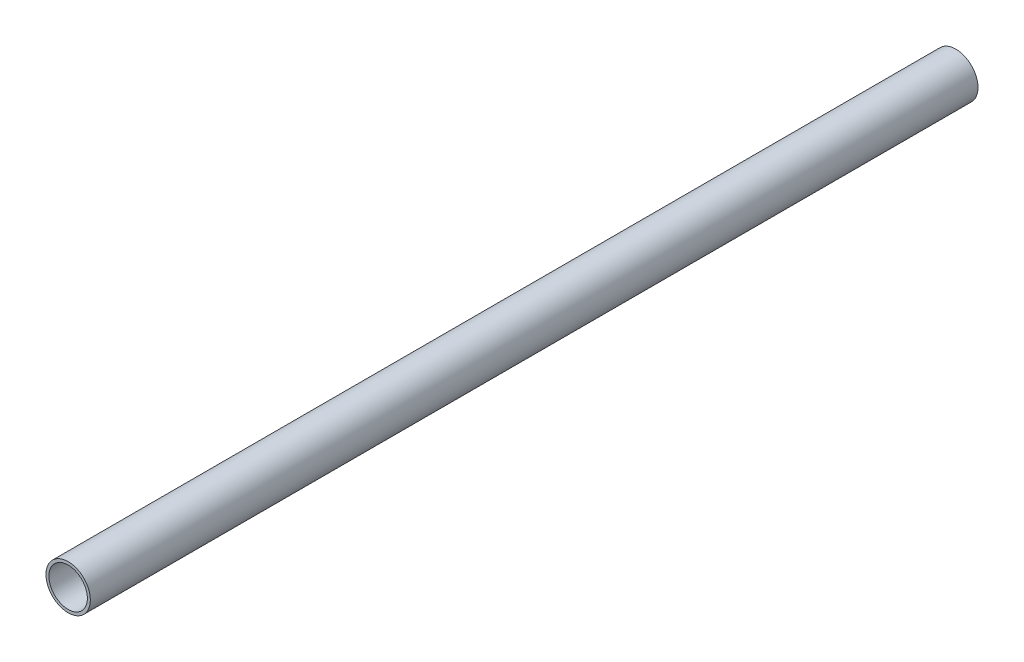
ISO-10303-21;
HEADER;
FILE_DESCRIPTION(('STEP AP214'),'2;1');
FILE_NAME('part.step','',(''),(''),'','','');
FILE_SCHEMA(('AUTOMOTIVE_DESIGN { 1 0 10303 214 1 1 1 1 }'));
ENDSEC;
DATA;
#1=APPLICATION_CONTEXT('core data for automotive mechanical design processes');
#2=APPLICATION_PROTOCOL_DEFINITION('international standard','automotive_design',2000,#1);
#3=PRODUCT_CONTEXT('',#1,'mechanical');
#4=PRODUCT('Part','Part','',(#3));
#5=PRODUCT_RELATED_PRODUCT_CATEGORY('part','',(#4));
#6=PRODUCT_DEFINITION_FORMATION('','',#4);
#7=PRODUCT_DEFINITION_CONTEXT('part definition',#1,'design');
#8=PRODUCT_DEFINITION('design','',#6,#7);
#9=PRODUCT_DEFINITION_SHAPE('','',#8);
#10=(LENGTH_UNIT() NAMED_UNIT(*) SI_UNIT(.MILLI.,.METRE.));
#11=(NAMED_UNIT(*) PLANE_ANGLE_UNIT() SI_UNIT($,.RADIAN.));
#12=(NAMED_UNIT(*) SI_UNIT($,.STERADIAN.) SOLID_ANGLE_UNIT());
#13=UNCERTAINTY_MEASURE_WITH_UNIT(LENGTH_MEASURE(1.E-05),#10,'distance_accuracy_value','');
#14=(GEOMETRIC_REPRESENTATION_CONTEXT(3) GLOBAL_UNCERTAINTY_ASSIGNED_CONTEXT((#13)) GLOBAL_UNIT_ASSIGNED_CONTEXT((#10,
#11,#12)) REPRESENTATION_CONTEXT('',''));
#15=CARTESIAN_POINT('',(0.,0.,0.));
#16=DIRECTION('',(0.,0.,1.));
#17=DIRECTION('',(1.,0.,0.));
#18=AXIS2_PLACEMENT_3D('',#15,#16,#17);
#19=CARTESIAN_POINT('',(0.,0.,600.));
#20=DIRECTION('',(0.,0.,1.));
#21=DIRECTION('',(1.,0.,0.));
#22=AXIS2_PLACEMENT_3D('',#19,#20,#21);
#23=PLANE('',#22);
#24=CARTESIAN_POINT('',(0.,0.,600.));
#25=DIRECTION('',(0.,0.,1.));
#26=DIRECTION('',(1.,0.,0.));
#27=AXIS2_PLACEMENT_3D('',#24,#25,#26);
#28=CIRCLE('',#27,15.);
#29=CARTESIAN_POINT('',(15.,0.,600.));
#30=VERTEX_POINT('',#29);
#31=EDGE_CURVE('E10',#30,#30,#28,.T.);
#32=ORIENTED_EDGE('',*,*,#31,.T.);
#33=EDGE_LOOP('',(#32));
#34=FACE_BOUND('',#33,.T.);
#35=CARTESIAN_POINT('',(0.,0.,600.));
#36=DIRECTION('',(0.,0.,1.));
#37=DIRECTION('',(1.,0.,0.));
#38=AXIS2_PLACEMENT_3D('',#35,#36,#37);
#39=CIRCLE('',#38,13.);
#40=CARTESIAN_POINT('',(13.,0.,600.));
#41=VERTEX_POINT('',#40);
#42=EDGE_CURVE('E50',#41,#41,#39,.T.);
#43=ORIENTED_EDGE('',*,*,#42,.F.);
#44=EDGE_LOOP('',(#43));
#45=FACE_BOUND('',#44,.T.);
#46=ADVANCED_FACE('F39',(#34,#45),#23,.T.);
#47=CARTESIAN_POINT('',(0.,0.,0.));
#48=DIRECTION('',(0.,0.,1.));
#49=DIRECTION('',(1.,0.,0.));
#50=AXIS2_PLACEMENT_3D('',#47,#48,#49);
#51=PLANE('',#50);
#52=CARTESIAN_POINT('',(0.,0.,0.));
#53=DIRECTION('',(0.,0.,1.));
#54=DIRECTION('',(1.,0.,0.));
#55=AXIS2_PLACEMENT_3D('',#52,#53,#54);
#56=CIRCLE('',#55,15.);
#57=CARTESIAN_POINT('',(15.,0.,0.));
#58=VERTEX_POINT('',#57);
#59=EDGE_CURVE('E43',#58,#58,#56,.T.);
#60=ORIENTED_EDGE('',*,*,#59,.F.);
#61=EDGE_LOOP('',(#60));
#62=FACE_BOUND('',#61,.T.);
#63=CARTESIAN_POINT('',(0.,0.,0.));
#64=DIRECTION('',(0.,0.,1.));
#65=DIRECTION('',(1.,0.,0.));
#66=AXIS2_PLACEMENT_3D('',#63,#64,#65);
#67=CIRCLE('',#66,13.);
#68=CARTESIAN_POINT('',(13.,0.,0.));
#69=VERTEX_POINT('',#68);
#70=EDGE_CURVE('E52',#69,#69,#67,.T.);
#71=ORIENTED_EDGE('',*,*,#70,.T.);
#72=EDGE_LOOP('',(#71));
#73=FACE_BOUND('',#72,.T.);
#74=ADVANCED_FACE('F62',(#62,#73),#51,.F.);
#75=CARTESIAN_POINT('',(0.,0.,600.));
#76=DIRECTION('',(0.,0.,-1.));
#77=DIRECTION('',(-1.,0.,0.));
#78=AXIS2_PLACEMENT_3D('',#75,#76,#77);
#79=CYLINDRICAL_SURFACE('',#78,15.);
#80=ORIENTED_EDGE('',*,*,#31,.F.);
#81=EDGE_LOOP('',(#80));
#82=FACE_BOUND('',#81,.T.);
#83=ORIENTED_EDGE('',*,*,#59,.T.);
#84=EDGE_LOOP('',(#83));
#85=FACE_BOUND('',#84,.T.);
#86=ADVANCED_FACE('F41',(#82,#85),#79,.T.);
#87=CARTESIAN_POINT('',(0.,0.,600.));
#88=DIRECTION('',(0.,0.,-1.));
#89=DIRECTION('',(-1.,0.,0.));
#90=AXIS2_PLACEMENT_3D('',#87,#88,#89);
#91=CYLINDRICAL_SURFACE('',#90,13.);
#92=ORIENTED_EDGE('',*,*,#42,.T.);
#93=EDGE_LOOP('',(#92));
#94=FACE_BOUND('',#93,.T.);
#95=ORIENTED_EDGE('',*,*,#70,.F.);
#96=EDGE_LOOP('',(#95));
#97=FACE_BOUND('',#96,.T.);
#98=ADVANCED_FACE('F58',(#94,#97),#91,.F.);
#99=CLOSED_SHELL('',(#46,#74,#86,#98));
#100=MANIFOLD_SOLID_BREP('B2',#99);
#101=ADVANCED_BREP_SHAPE_REPRESENTATION('',(#18,#100),#14);
#102=SHAPE_DEFINITION_REPRESENTATION(#9,#101);
ENDSEC;
END-ISO-10303-21;
